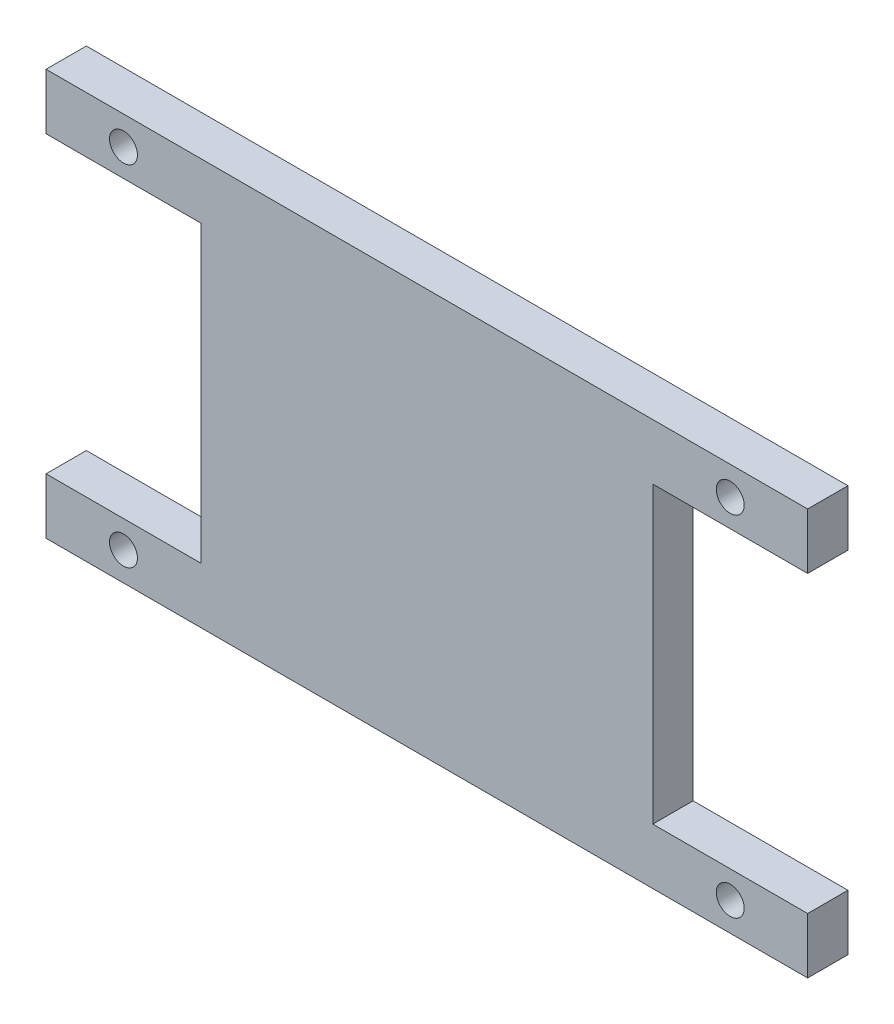
ISO-10303-21;
HEADER;
FILE_DESCRIPTION(('STEP AP214'),'2;1');
FILE_NAME('part.step','',(''),(''),'','','');
FILE_SCHEMA(('AUTOMOTIVE_DESIGN { 1 0 10303 214 1 1 1 1 }'));
ENDSEC;
DATA;
#1=APPLICATION_CONTEXT('core data for automotive mechanical design processes');
#2=APPLICATION_PROTOCOL_DEFINITION('international standard','automotive_design',2000,#1);
#3=PRODUCT_CONTEXT('',#1,'mechanical');
#4=PRODUCT('Part','Part','',(#3));
#5=PRODUCT_RELATED_PRODUCT_CATEGORY('part','',(#4));
#6=PRODUCT_DEFINITION_FORMATION('','',#4);
#7=PRODUCT_DEFINITION_CONTEXT('part definition',#1,'design');
#8=PRODUCT_DEFINITION('design','',#6,#7);
#9=PRODUCT_DEFINITION_SHAPE('','',#8);
#10=(LENGTH_UNIT() NAMED_UNIT(*) SI_UNIT(.MILLI.,.METRE.));
#11=(NAMED_UNIT(*) PLANE_ANGLE_UNIT() SI_UNIT($,.RADIAN.));
#12=(NAMED_UNIT(*) SI_UNIT($,.STERADIAN.) SOLID_ANGLE_UNIT());
#13=UNCERTAINTY_MEASURE_WITH_UNIT(LENGTH_MEASURE(1.E-05),#10,'distance_accuracy_value','');
#14=(GEOMETRIC_REPRESENTATION_CONTEXT(3) GLOBAL_UNCERTAINTY_ASSIGNED_CONTEXT((#13)) GLOBAL_UNIT_ASSIGNED_CONTEXT((#10,
#11,#12)) REPRESENTATION_CONTEXT('',''));
#15=CARTESIAN_POINT('',(0.,0.,0.));
#16=DIRECTION('',(0.,0.,1.));
#17=DIRECTION('',(1.,0.,0.));
#18=AXIS2_PLACEMENT_3D('',#15,#16,#17);
#19=CARTESIAN_POINT('',(47.8,0.,3.175));
#20=DIRECTION('',(1.,0.,0.));
#21=DIRECTION('',(0.,0.,-1.));
#22=AXIS2_PLACEMENT_3D('',#19,#20,#21);
#23=PLANE('',#22);
#24=DIRECTION('',(0.,-1.,0.));
#25=VECTOR('',#24,1.);
#26=CARTESIAN_POINT('',(47.8,0.,0.));
#27=LINE('',#26,#25);
#28=CARTESIAN_POINT('',(47.8,27.6,0.));
#29=VERTEX_POINT('',#28);
#30=CARTESIAN_POINT('',(47.8,4.4,0.));
#31=VERTEX_POINT('',#30);
#32=EDGE_CURVE('E191',#29,#31,#27,.T.);
#33=ORIENTED_EDGE('',*,*,#32,.F.);
#34=DIRECTION('',(0.,0.,-1.));
#35=VECTOR('',#34,1.);
#36=CARTESIAN_POINT('',(47.8,27.6,3.175));
#37=LINE('',#36,#35);
#38=CARTESIAN_POINT('',(47.8,27.6,3.175));
#39=VERTEX_POINT('',#38);
#40=EDGE_CURVE('E11',#39,#29,#37,.T.);
#41=ORIENTED_EDGE('',*,*,#40,.F.);
#42=DIRECTION('',(0.,-1.,0.));
#43=VECTOR('',#42,1.);
#44=CARTESIAN_POINT('',(47.8,0.,3.175));
#45=LINE('',#44,#43);
#46=CARTESIAN_POINT('',(47.8,4.4,3.175));
#47=VERTEX_POINT('',#46);
#48=EDGE_CURVE('E295',#39,#47,#45,.T.);
#49=ORIENTED_EDGE('',*,*,#48,.T.);
#50=DIRECTION('',(0.,0.,-1.));
#51=VECTOR('',#50,1.);
#52=CARTESIAN_POINT('',(47.8,4.4,3.175));
#53=LINE('',#52,#51);
#54=EDGE_CURVE('E99',#47,#31,#53,.T.);
#55=ORIENTED_EDGE('',*,*,#54,.T.);
#56=EDGE_LOOP('',(#33,#41,#49,#55));
#57=FACE_BOUND('',#56,.T.);
#58=ADVANCED_FACE('F36',(#57),#23,.T.);
#59=CARTESIAN_POINT('',(0.,27.6,3.175));
#60=DIRECTION('',(0.,-1.,0.));
#61=DIRECTION('',(0.,0.,-1.));
#62=AXIS2_PLACEMENT_3D('',#59,#60,#61);
#63=PLANE('',#62);
#64=DIRECTION('',(-1.,0.,0.));
#65=VECTOR('',#64,1.);
#66=CARTESIAN_POINT('',(0.,27.6,0.));
#67=LINE('',#66,#65);
#68=CARTESIAN_POINT('',(60.,27.6,0.));
#69=VERTEX_POINT('',#68);
#70=EDGE_CURVE('E184',#69,#29,#67,.T.);
#71=ORIENTED_EDGE('',*,*,#70,.F.);
#72=DIRECTION('',(0.,0.,-1.));
#73=VECTOR('',#72,1.);
#74=CARTESIAN_POINT('',(60.,27.6,3.175));
#75=LINE('',#74,#73);
#76=CARTESIAN_POINT('',(60.,27.6,3.175));
#77=VERTEX_POINT('',#76);
#78=EDGE_CURVE('E45',#77,#69,#75,.T.);
#79=ORIENTED_EDGE('',*,*,#78,.F.);
#80=DIRECTION('',(-1.,0.,0.));
#81=VECTOR('',#80,1.);
#82=CARTESIAN_POINT('',(0.,27.6,3.175));
#83=LINE('',#82,#81);
#84=EDGE_CURVE('E297',#77,#39,#83,.T.);
#85=ORIENTED_EDGE('',*,*,#84,.T.);
#86=ORIENTED_EDGE('',*,*,#40,.T.);
#87=EDGE_LOOP('',(#71,#79,#85,#86));
#88=FACE_BOUND('',#87,.T.);
#89=ADVANCED_FACE('F190',(#88),#63,.T.);
#90=CARTESIAN_POINT('',(60.,0.,3.175));
#91=DIRECTION('',(-1.,0.,0.));
#92=DIRECTION('',(0.,0.,1.));
#93=AXIS2_PLACEMENT_3D('',#90,#91,#92);
#94=PLANE('',#93);
#95=DIRECTION('',(0.,1.,0.));
#96=VECTOR('',#95,1.);
#97=CARTESIAN_POINT('',(60.,0.,0.));
#98=LINE('',#97,#96);
#99=CARTESIAN_POINT('',(60.,32.,0.));
#100=VERTEX_POINT('',#99);
#101=EDGE_CURVE('E176',#69,#100,#98,.T.);
#102=ORIENTED_EDGE('',*,*,#101,.T.);
#103=DIRECTION('',(0.,0.,-1.));
#104=VECTOR('',#103,1.);
#105=CARTESIAN_POINT('',(60.,32.,3.175));
#106=LINE('',#105,#104);
#107=CARTESIAN_POINT('',(60.,32.,3.175));
#108=VERTEX_POINT('',#107);
#109=EDGE_CURVE('E169',#108,#100,#106,.T.);
#110=ORIENTED_EDGE('',*,*,#109,.F.);
#111=DIRECTION('',(0.,1.,0.));
#112=VECTOR('',#111,1.);
#113=CARTESIAN_POINT('',(60.,0.,3.175));
#114=LINE('',#113,#112);
#115=EDGE_CURVE('E140',#77,#108,#114,.T.);
#116=ORIENTED_EDGE('',*,*,#115,.F.);
#117=ORIENTED_EDGE('',*,*,#78,.T.);
#118=EDGE_LOOP('',(#102,#110,#116,#117));
#119=FACE_BOUND('',#118,.T.);
#120=ADVANCED_FACE('F174',(#119),#94,.F.);
#121=CARTESIAN_POINT('',(0.,32.,3.175));
#122=DIRECTION('',(0.,1.,0.));
#123=DIRECTION('',(0.,0.,1.));
#124=AXIS2_PLACEMENT_3D('',#121,#122,#123);
#125=PLANE('',#124);
#126=DIRECTION('',(1.,0.,0.));
#127=VECTOR('',#126,1.);
#128=CARTESIAN_POINT('',(0.,32.,0.));
#129=LINE('',#128,#127);
#130=CARTESIAN_POINT('',(0.,32.,0.));
#131=VERTEX_POINT('',#130);
#132=EDGE_CURVE('E187',#131,#100,#129,.T.);
#133=ORIENTED_EDGE('',*,*,#132,.F.);
#134=DIRECTION('',(0.,0.,-1.));
#135=VECTOR('',#134,1.);
#136=CARTESIAN_POINT('',(0.,32.,3.175));
#137=LINE('',#136,#135);
#138=CARTESIAN_POINT('',(0.,32.,3.175));
#139=VERTEX_POINT('',#138);
#140=EDGE_CURVE('E167',#139,#131,#137,.T.);
#141=ORIENTED_EDGE('',*,*,#140,.F.);
#142=DIRECTION('',(1.,0.,0.));
#143=VECTOR('',#142,1.);
#144=CARTESIAN_POINT('',(0.,32.,3.175));
#145=LINE('',#144,#143);
#146=EDGE_CURVE('E303',#139,#108,#145,.T.);
#147=ORIENTED_EDGE('',*,*,#146,.T.);
#148=ORIENTED_EDGE('',*,*,#109,.T.);
#149=EDGE_LOOP('',(#133,#141,#147,#148));
#150=FACE_BOUND('',#149,.T.);
#151=ADVANCED_FACE('F248',(#150),#125,.T.);
#152=CARTESIAN_POINT('',(0.,0.,3.175));
#153=DIRECTION('',(-1.,0.,0.));
#154=DIRECTION('',(0.,0.,1.));
#155=AXIS2_PLACEMENT_3D('',#152,#153,#154);
#156=PLANE('',#155);
#157=DIRECTION('',(0.,1.,0.));
#158=VECTOR('',#157,1.);
#159=CARTESIAN_POINT('',(0.,0.,0.));
#160=LINE('',#159,#158);
#161=CARTESIAN_POINT('',(0.,27.6,0.));
#162=VERTEX_POINT('',#161);
#163=EDGE_CURVE('E198',#162,#131,#160,.T.);
#164=ORIENTED_EDGE('',*,*,#163,.F.);
#165=DIRECTION('',(0.,0.,-1.));
#166=VECTOR('',#165,1.);
#167=CARTESIAN_POINT('',(0.,27.6,3.175));
#168=LINE('',#167,#166);
#169=CARTESIAN_POINT('',(0.,27.6,3.175));
#170=VERTEX_POINT('',#169);
#171=EDGE_CURVE('E165',#170,#162,#168,.T.);
#172=ORIENTED_EDGE('',*,*,#171,.F.);
#173=DIRECTION('',(0.,1.,0.));
#174=VECTOR('',#173,1.);
#175=CARTESIAN_POINT('',(0.,0.,3.175));
#176=LINE('',#175,#174);
#177=EDGE_CURVE('E306',#170,#139,#176,.T.);
#178=ORIENTED_EDGE('',*,*,#177,.T.);
#179=ORIENTED_EDGE('',*,*,#140,.T.);
#180=EDGE_LOOP('',(#164,#172,#178,#179));
#181=FACE_BOUND('',#180,.T.);
#182=ADVANCED_FACE('F251',(#181),#156,.T.);
#183=CARTESIAN_POINT('',(0.,27.6,3.175));
#184=DIRECTION('',(0.,1.,0.));
#185=DIRECTION('',(0.,0.,1.));
#186=AXIS2_PLACEMENT_3D('',#183,#184,#185);
#187=PLANE('',#186);
#188=DIRECTION('',(1.,0.,0.));
#189=VECTOR('',#188,1.);
#190=CARTESIAN_POINT('',(0.,27.6,0.));
#191=LINE('',#190,#189);
#192=CARTESIAN_POINT('',(12.2,27.6,0.));
#193=VERTEX_POINT('',#192);
#194=EDGE_CURVE('E200',#162,#193,#191,.T.);
#195=ORIENTED_EDGE('',*,*,#194,.T.);
#196=DIRECTION('',(0.,0.,-1.));
#197=VECTOR('',#196,1.);
#198=CARTESIAN_POINT('',(12.2,27.6,3.175));
#199=LINE('',#198,#197);
#200=CARTESIAN_POINT('',(12.2,27.6,3.175));
#201=VERTEX_POINT('',#200);
#202=EDGE_CURVE('E162',#201,#193,#199,.T.);
#203=ORIENTED_EDGE('',*,*,#202,.F.);
#204=DIRECTION('',(1.,0.,0.));
#205=VECTOR('',#204,1.);
#206=CARTESIAN_POINT('',(0.,27.6,3.175));
#207=LINE('',#206,#205);
#208=EDGE_CURVE('E309',#170,#201,#207,.T.);
#209=ORIENTED_EDGE('',*,*,#208,.F.);
#210=ORIENTED_EDGE('',*,*,#171,.T.);
#211=EDGE_LOOP('',(#195,#203,#209,#210));
#212=FACE_BOUND('',#211,.T.);
#213=ADVANCED_FACE('F253',(#212),#187,.F.);
#214=CARTESIAN_POINT('',(12.2,0.,3.175));
#215=DIRECTION('',(1.,0.,0.));
#216=DIRECTION('',(0.,1.,0.));
#217=AXIS2_PLACEMENT_3D('',#214,#215,#216);
#218=PLANE('',#217);
#219=DIRECTION('',(0.,-1.,0.));
#220=VECTOR('',#219,1.);
#221=CARTESIAN_POINT('',(12.2,0.,0.));
#222=LINE('',#221,#220);
#223=CARTESIAN_POINT('',(12.2,4.4,0.));
#224=VERTEX_POINT('',#223);
#225=EDGE_CURVE('E204',#193,#224,#222,.T.);
#226=ORIENTED_EDGE('',*,*,#225,.T.);
#227=DIRECTION('',(0.,0.,-1.));
#228=VECTOR('',#227,1.);
#229=CARTESIAN_POINT('',(12.2,4.4,3.175));
#230=LINE('',#229,#228);
#231=CARTESIAN_POINT('',(12.2,4.4,3.175));
#232=VERTEX_POINT('',#231);
#233=EDGE_CURVE('E160',#232,#224,#230,.T.);
#234=ORIENTED_EDGE('',*,*,#233,.F.);
#235=DIRECTION('',(0.,-1.,0.));
#236=VECTOR('',#235,1.);
#237=CARTESIAN_POINT('',(12.2,0.,3.175));
#238=LINE('',#237,#236);
#239=EDGE_CURVE('E312',#201,#232,#238,.T.);
#240=ORIENTED_EDGE('',*,*,#239,.F.);
#241=ORIENTED_EDGE('',*,*,#202,.T.);
#242=EDGE_LOOP('',(#226,#234,#240,#241));
#243=FACE_BOUND('',#242,.T.);
#244=ADVANCED_FACE('F256',(#243),#218,.F.);
#245=CARTESIAN_POINT('',(0.,4.4,3.175));
#246=DIRECTION('',(0.,1.,0.));
#247=DIRECTION('',(0.,0.,1.));
#248=AXIS2_PLACEMENT_3D('',#245,#246,#247);
#249=PLANE('',#248);
#250=DIRECTION('',(1.,0.,0.));
#251=VECTOR('',#250,1.);
#252=CARTESIAN_POINT('',(0.,4.4,0.));
#253=LINE('',#252,#251);
#254=CARTESIAN_POINT('',(0.,4.4,0.));
#255=VERTEX_POINT('',#254);
#256=EDGE_CURVE('E207',#255,#224,#253,.T.);
#257=ORIENTED_EDGE('',*,*,#256,.F.);
#258=DIRECTION('',(0.,0.,-1.));
#259=VECTOR('',#258,1.);
#260=CARTESIAN_POINT('',(0.,4.4,3.175));
#261=LINE('',#260,#259);
#262=CARTESIAN_POINT('',(0.,4.4,3.175));
#263=VERTEX_POINT('',#262);
#264=EDGE_CURVE('E154',#263,#255,#261,.T.);
#265=ORIENTED_EDGE('',*,*,#264,.F.);
#266=DIRECTION('',(1.,0.,0.));
#267=VECTOR('',#266,1.);
#268=CARTESIAN_POINT('',(0.,4.4,3.175));
#269=LINE('',#268,#267);
#270=EDGE_CURVE('E313',#263,#232,#269,.T.);
#271=ORIENTED_EDGE('',*,*,#270,.T.);
#272=ORIENTED_EDGE('',*,*,#233,.T.);
#273=EDGE_LOOP('',(#257,#265,#271,#272));
#274=FACE_BOUND('',#273,.T.);
#275=ADVANCED_FACE('F260',(#274),#249,.T.);
#276=CARTESIAN_POINT('',(0.,0.,0.));
#277=VERTEX_POINT('',#276);
#278=EDGE_CURVE('E201',#277,#255,#160,.T.);
#279=ORIENTED_EDGE('',*,*,#278,.F.);
#280=DIRECTION('',(0.,0.,-1.));
#281=VECTOR('',#280,1.);
#282=CARTESIAN_POINT('',(0.,0.,3.175));
#283=LINE('',#282,#281);
#284=CARTESIAN_POINT('',(0.,0.,3.175));
#285=VERTEX_POINT('',#284);
#286=EDGE_CURVE('E152',#285,#277,#283,.T.);
#287=ORIENTED_EDGE('',*,*,#286,.F.);
#288=EDGE_CURVE('E146',#285,#263,#176,.T.);
#289=ORIENTED_EDGE('',*,*,#288,.T.);
#290=ORIENTED_EDGE('',*,*,#264,.T.);
#291=EDGE_LOOP('',(#279,#287,#289,#290));
#292=FACE_BOUND('',#291,.T.);
#293=ADVANCED_FACE('F264',(#292),#156,.T.);
#294=CARTESIAN_POINT('',(0.,0.,3.175));
#295=DIRECTION('',(0.,1.,0.));
#296=DIRECTION('',(0.,0.,1.));
#297=AXIS2_PLACEMENT_3D('',#294,#295,#296);
#298=PLANE('',#297);
#299=DIRECTION('',(1.,0.,0.));
#300=VECTOR('',#299,1.);
#301=CARTESIAN_POINT('',(0.,0.,0.));
#302=LINE('',#301,#300);
#303=CARTESIAN_POINT('',(60.,0.,0.));
#304=VERTEX_POINT('',#303);
#305=EDGE_CURVE('E151',#277,#304,#302,.T.);
#306=ORIENTED_EDGE('',*,*,#305,.T.);
#307=DIRECTION('',(0.,0.,-1.));
#308=VECTOR('',#307,1.);
#309=CARTESIAN_POINT('',(60.,0.,3.175));
#310=LINE('',#309,#308);
#311=CARTESIAN_POINT('',(60.,0.,3.175));
#312=VERTEX_POINT('',#311);
#313=EDGE_CURVE('E135',#312,#304,#310,.T.);
#314=ORIENTED_EDGE('',*,*,#313,.F.);
#315=DIRECTION('',(1.,0.,0.));
#316=VECTOR('',#315,1.);
#317=CARTESIAN_POINT('',(0.,0.,3.175));
#318=LINE('',#317,#316);
#319=EDGE_CURVE('E138',#285,#312,#318,.T.);
#320=ORIENTED_EDGE('',*,*,#319,.F.);
#321=ORIENTED_EDGE('',*,*,#286,.T.);
#322=EDGE_LOOP('',(#306,#314,#320,#321));
#323=FACE_BOUND('',#322,.T.);
#324=ADVANCED_FACE('F149',(#323),#298,.F.);
#325=CARTESIAN_POINT('',(60.,4.4,0.));
#326=VERTEX_POINT('',#325);
#327=EDGE_CURVE('E189',#304,#326,#98,.T.);
#328=ORIENTED_EDGE('',*,*,#327,.T.);
#329=DIRECTION('',(0.,0.,-1.));
#330=VECTOR('',#329,1.);
#331=CARTESIAN_POINT('',(60.,4.4,3.175));
#332=LINE('',#331,#330);
#333=CARTESIAN_POINT('',(60.,4.4,3.175));
#334=VERTEX_POINT('',#333);
#335=EDGE_CURVE('E137',#334,#326,#332,.T.);
#336=ORIENTED_EDGE('',*,*,#335,.F.);
#337=EDGE_CURVE('E130',#312,#334,#114,.T.);
#338=ORIENTED_EDGE('',*,*,#337,.F.);
#339=ORIENTED_EDGE('',*,*,#313,.T.);
#340=EDGE_LOOP('',(#328,#336,#338,#339));
#341=FACE_BOUND('',#340,.T.);
#342=ADVANCED_FACE('F133',(#341),#94,.F.);
#343=CARTESIAN_POINT('',(6.1,29.75,3.175));
#344=DIRECTION('',(0.,0.,-1.));
#345=DIRECTION('',(-1.,0.,0.));
#346=AXIS2_PLACEMENT_3D('',#343,#344,#345);
#347=CYLINDRICAL_SURFACE('',#346,1.1);
#348=CARTESIAN_POINT('',(6.1,29.75,3.175));
#349=DIRECTION('',(0.,0.,1.));
#350=DIRECTION('',(1.,0.,0.));
#351=AXIS2_PLACEMENT_3D('',#348,#349,#350);
#352=CIRCLE('',#351,1.1);
#353=CARTESIAN_POINT('',(7.2,29.75,3.175));
#354=VERTEX_POINT('',#353);
#355=EDGE_CURVE('E294',#354,#354,#352,.T.);
#356=ORIENTED_EDGE('',*,*,#355,.T.);
#357=EDGE_LOOP('',(#356));
#358=FACE_BOUND('',#357,.T.);
#359=CARTESIAN_POINT('',(6.1,29.75,0.));
#360=DIRECTION('',(0.,0.,1.));
#361=DIRECTION('',(1.,0.,0.));
#362=AXIS2_PLACEMENT_3D('',#359,#360,#361);
#363=CIRCLE('',#362,1.1);
#364=CARTESIAN_POINT('',(7.2,29.75,0.));
#365=VERTEX_POINT('',#364);
#366=EDGE_CURVE('E193',#365,#365,#363,.T.);
#367=ORIENTED_EDGE('',*,*,#366,.F.);
#368=EDGE_LOOP('',(#367));
#369=FACE_BOUND('',#368,.T.);
#370=ADVANCED_FACE('F227',(#358,#369),#347,.F.);
#371=CARTESIAN_POINT('',(6.1,2.25,3.175));
#372=DIRECTION('',(0.,0.,-1.));
#373=DIRECTION('',(-1.,0.,0.));
#374=AXIS2_PLACEMENT_3D('',#371,#372,#373);
#375=CYLINDRICAL_SURFACE('',#374,1.1);
#376=CARTESIAN_POINT('',(6.1,2.25,3.175));
#377=DIRECTION('',(0.,0.,1.));
#378=DIRECTION('',(1.,0.,0.));
#379=AXIS2_PLACEMENT_3D('',#376,#377,#378);
#380=CIRCLE('',#379,1.1);
#381=CARTESIAN_POINT('',(7.2,2.25,3.175));
#382=VERTEX_POINT('',#381);
#383=EDGE_CURVE('E292',#382,#382,#380,.T.);
#384=ORIENTED_EDGE('',*,*,#383,.T.);
#385=EDGE_LOOP('',(#384));
#386=FACE_BOUND('',#385,.T.);
#387=CARTESIAN_POINT('',(6.1,2.25,0.));
#388=DIRECTION('',(0.,0.,1.));
#389=DIRECTION('',(1.,0.,0.));
#390=AXIS2_PLACEMENT_3D('',#387,#388,#389);
#391=CIRCLE('',#390,1.1);
#392=CARTESIAN_POINT('',(7.2,2.25,0.));
#393=VERTEX_POINT('',#392);
#394=EDGE_CURVE('E221',#393,#393,#391,.T.);
#395=ORIENTED_EDGE('',*,*,#394,.F.);
#396=EDGE_LOOP('',(#395));
#397=FACE_BOUND('',#396,.T.);
#398=ADVANCED_FACE('F229',(#386,#397),#375,.F.);
#399=CARTESIAN_POINT('',(53.9,29.75,3.175));
#400=DIRECTION('',(0.,0.,-1.));
#401=DIRECTION('',(-1.,0.,0.));
#402=AXIS2_PLACEMENT_3D('',#399,#400,#401);
#403=CYLINDRICAL_SURFACE('',#402,1.1);
#404=CARTESIAN_POINT('',(53.9,29.75,3.175));
#405=DIRECTION('',(0.,0.,1.));
#406=DIRECTION('',(1.,0.,0.));
#407=AXIS2_PLACEMENT_3D('',#404,#405,#406);
#408=CIRCLE('',#407,1.1);
#409=CARTESIAN_POINT('',(55.,29.75,3.175));
#410=VERTEX_POINT('',#409);
#411=EDGE_CURVE('E288',#410,#410,#408,.T.);
#412=ORIENTED_EDGE('',*,*,#411,.T.);
#413=EDGE_LOOP('',(#412));
#414=FACE_BOUND('',#413,.T.);
#415=CARTESIAN_POINT('',(53.9,29.75,0.));
#416=DIRECTION('',(0.,0.,1.));
#417=DIRECTION('',(1.,0.,0.));
#418=AXIS2_PLACEMENT_3D('',#415,#416,#417);
#419=CIRCLE('',#418,1.1);
#420=CARTESIAN_POINT('',(55.,29.75,0.));
#421=VERTEX_POINT('',#420);
#422=EDGE_CURVE('E218',#421,#421,#419,.T.);
#423=ORIENTED_EDGE('',*,*,#422,.F.);
#424=EDGE_LOOP('',(#423));
#425=FACE_BOUND('',#424,.T.);
#426=ADVANCED_FACE('F236',(#414,#425),#403,.F.);
#427=CARTESIAN_POINT('',(53.9,2.25,3.175));
#428=DIRECTION('',(0.,0.,-1.));
#429=DIRECTION('',(-1.,0.,0.));
#430=AXIS2_PLACEMENT_3D('',#427,#428,#429);
#431=CYLINDRICAL_SURFACE('',#430,1.1);
#432=CARTESIAN_POINT('',(53.9,2.25,3.175));
#433=DIRECTION('',(0.,0.,1.));
#434=DIRECTION('',(1.,0.,0.));
#435=AXIS2_PLACEMENT_3D('',#432,#433,#434);
#436=CIRCLE('',#435,1.1);
#437=CARTESIAN_POINT('',(55.,2.25,3.175));
#438=VERTEX_POINT('',#437);
#439=EDGE_CURVE('E211',#438,#438,#436,.T.);
#440=ORIENTED_EDGE('',*,*,#439,.T.);
#441=EDGE_LOOP('',(#440));
#442=FACE_BOUND('',#441,.T.);
#443=CARTESIAN_POINT('',(53.9,2.25,0.));
#444=DIRECTION('',(0.,0.,1.));
#445=DIRECTION('',(1.,0.,0.));
#446=AXIS2_PLACEMENT_3D('',#443,#444,#445);
#447=CIRCLE('',#446,1.1);
#448=CARTESIAN_POINT('',(55.,2.25,0.));
#449=VERTEX_POINT('',#448);
#450=EDGE_CURVE('E215',#449,#449,#447,.T.);
#451=ORIENTED_EDGE('',*,*,#450,.F.);
#452=EDGE_LOOP('',(#451));
#453=FACE_BOUND('',#452,.T.);
#454=ADVANCED_FACE('F38',(#442,#453),#431,.F.);
#455=CARTESIAN_POINT('',(0.,4.39999999999999,3.175));
#456=DIRECTION('',(0.,-1.,0.));
#457=DIRECTION('',(1.,0.,0.));
#458=AXIS2_PLACEMENT_3D('',#455,#456,#457);
#459=PLANE('',#458);
#460=DIRECTION('',(-1.,0.,0.));
#461=VECTOR('',#460,1.);
#462=CARTESIAN_POINT('',(0.,4.39999999999999,0.));
#463=LINE('',#462,#461);
#464=EDGE_CURVE('E92',#326,#31,#463,.T.);
#465=ORIENTED_EDGE('',*,*,#464,.T.);
#466=ORIENTED_EDGE('',*,*,#54,.F.);
#467=DIRECTION('',(-1.,0.,0.));
#468=VECTOR('',#467,1.);
#469=CARTESIAN_POINT('',(0.,4.39999999999999,3.175));
#470=LINE('',#469,#468);
#471=EDGE_CURVE('E53',#334,#47,#470,.T.);
#472=ORIENTED_EDGE('',*,*,#471,.F.);
#473=ORIENTED_EDGE('',*,*,#335,.T.);
#474=EDGE_LOOP('',(#465,#466,#472,#473));
#475=FACE_BOUND('',#474,.T.);
#476=ADVANCED_FACE('F271',(#475),#459,.F.);
#477=CARTESIAN_POINT('',(0.,0.,3.175));
#478=DIRECTION('',(0.,0.,1.));
#479=DIRECTION('',(1.,0.,0.));
#480=AXIS2_PLACEMENT_3D('',#477,#478,#479);
#481=PLANE('',#480);
#482=ORIENTED_EDGE('',*,*,#439,.F.);
#483=EDGE_LOOP('',(#482));
#484=FACE_BOUND('',#483,.T.);
#485=ORIENTED_EDGE('',*,*,#411,.F.);
#486=EDGE_LOOP('',(#485));
#487=FACE_BOUND('',#486,.T.);
#488=ORIENTED_EDGE('',*,*,#383,.F.);
#489=EDGE_LOOP('',(#488));
#490=FACE_BOUND('',#489,.T.);
#491=ORIENTED_EDGE('',*,*,#355,.F.);
#492=EDGE_LOOP('',(#491));
#493=FACE_BOUND('',#492,.T.);
#494=ORIENTED_EDGE('',*,*,#48,.F.);
#495=ORIENTED_EDGE('',*,*,#84,.F.);
#496=ORIENTED_EDGE('',*,*,#115,.T.);
#497=ORIENTED_EDGE('',*,*,#146,.F.);
#498=ORIENTED_EDGE('',*,*,#177,.F.);
#499=ORIENTED_EDGE('',*,*,#208,.T.);
#500=ORIENTED_EDGE('',*,*,#239,.T.);
#501=ORIENTED_EDGE('',*,*,#270,.F.);
#502=ORIENTED_EDGE('',*,*,#288,.F.);
#503=ORIENTED_EDGE('',*,*,#319,.T.);
#504=ORIENTED_EDGE('',*,*,#337,.T.);
#505=ORIENTED_EDGE('',*,*,#471,.T.);
#506=EDGE_LOOP('',(#494,#495,#496,#497,#498,#499,#500,#501,#502,#503,#504,#505));
#507=FACE_BOUND('',#506,.T.);
#508=ADVANCED_FACE('F143',(#484,#487,#490,#493,#507),#481,.T.);
#509=CARTESIAN_POINT('',(0.,0.,0.));
#510=DIRECTION('',(0.,0.,1.));
#511=DIRECTION('',(1.,0.,0.));
#512=AXIS2_PLACEMENT_3D('',#509,#510,#511);
#513=PLANE('',#512);
#514=ORIENTED_EDGE('',*,*,#450,.T.);
#515=EDGE_LOOP('',(#514));
#516=FACE_BOUND('',#515,.T.);
#517=ORIENTED_EDGE('',*,*,#422,.T.);
#518=EDGE_LOOP('',(#517));
#519=FACE_BOUND('',#518,.T.);
#520=ORIENTED_EDGE('',*,*,#394,.T.);
#521=EDGE_LOOP('',(#520));
#522=FACE_BOUND('',#521,.T.);
#523=ORIENTED_EDGE('',*,*,#366,.T.);
#524=EDGE_LOOP('',(#523));
#525=FACE_BOUND('',#524,.T.);
#526=ORIENTED_EDGE('',*,*,#32,.T.);
#527=ORIENTED_EDGE('',*,*,#464,.F.);
#528=ORIENTED_EDGE('',*,*,#327,.F.);
#529=ORIENTED_EDGE('',*,*,#305,.F.);
#530=ORIENTED_EDGE('',*,*,#278,.T.);
#531=ORIENTED_EDGE('',*,*,#256,.T.);
#532=ORIENTED_EDGE('',*,*,#225,.F.);
#533=ORIENTED_EDGE('',*,*,#194,.F.);
#534=ORIENTED_EDGE('',*,*,#163,.T.);
#535=ORIENTED_EDGE('',*,*,#132,.T.);
#536=ORIENTED_EDGE('',*,*,#101,.F.);
#537=ORIENTED_EDGE('',*,*,#70,.T.);
#538=EDGE_LOOP('',(#526,#527,#528,#529,#530,#531,#532,#533,#534,#535,#536,#537));
#539=FACE_BOUND('',#538,.T.);
#540=ADVANCED_FACE('F183',(#516,#519,#522,#525,#539),#513,.F.);
#541=CLOSED_SHELL('',(#58,#89,#120,#151,#182,#213,#244,#275,#293,#324,#342,#370,#398,#426,#454,
#476,#508,#540));
#542=MANIFOLD_SOLID_BREP('B2',#541);
#543=ADVANCED_BREP_SHAPE_REPRESENTATION('',(#18,#542),#14);
#544=SHAPE_DEFINITION_REPRESENTATION(#9,#543);
ENDSEC;
END-ISO-10303-21;
